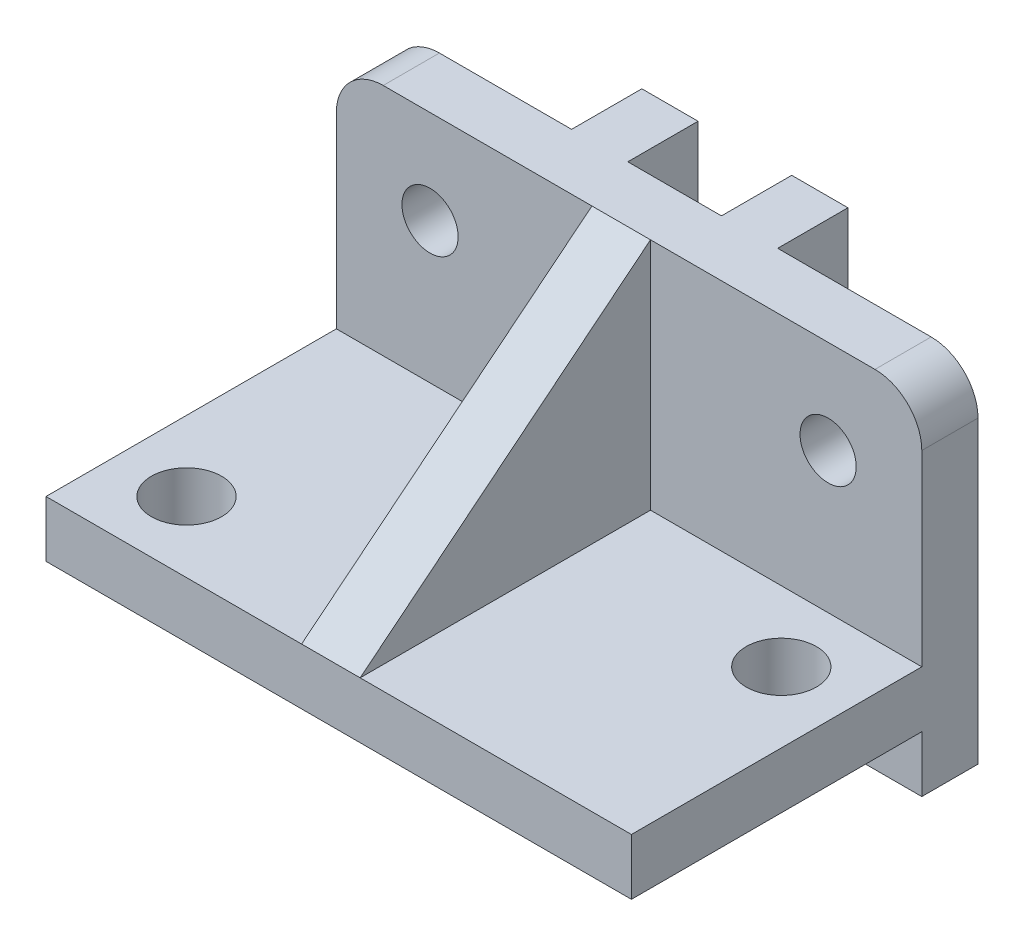
ISO-10303-21;
HEADER;
FILE_DESCRIPTION(('STEP AP214'),'2;1');
FILE_NAME('part.step','',(''),(''),'','','');
FILE_SCHEMA(('AUTOMOTIVE_DESIGN { 1 0 10303 214 1 1 1 1 }'));
ENDSEC;
DATA;
#1=APPLICATION_CONTEXT('core data for automotive mechanical design processes');
#2=APPLICATION_PROTOCOL_DEFINITION('international standard','automotive_design',2000,#1);
#3=PRODUCT_CONTEXT('',#1,'mechanical');
#4=PRODUCT('Part','Part','',(#3));
#5=PRODUCT_RELATED_PRODUCT_CATEGORY('part','',(#4));
#6=PRODUCT_DEFINITION_FORMATION('','',#4);
#7=PRODUCT_DEFINITION_CONTEXT('part definition',#1,'design');
#8=PRODUCT_DEFINITION('design','',#6,#7);
#9=PRODUCT_DEFINITION_SHAPE('','',#8);
#10=(LENGTH_UNIT() NAMED_UNIT(*) SI_UNIT(.MILLI.,.METRE.));
#11=(NAMED_UNIT(*) PLANE_ANGLE_UNIT() SI_UNIT($,.RADIAN.));
#12=(NAMED_UNIT(*) SI_UNIT($,.STERADIAN.) SOLID_ANGLE_UNIT());
#13=UNCERTAINTY_MEASURE_WITH_UNIT(LENGTH_MEASURE(1.E-05),#10,'distance_accuracy_value','');
#14=(GEOMETRIC_REPRESENTATION_CONTEXT(3) GLOBAL_UNCERTAINTY_ASSIGNED_CONTEXT((#13)) GLOBAL_UNIT_ASSIGNED_CONTEXT((#10,
#11,#12)) REPRESENTATION_CONTEXT('',''));
#15=CARTESIAN_POINT('',(0.,0.,0.));
#16=DIRECTION('',(0.,0.,1.));
#17=DIRECTION('',(1.,0.,0.));
#18=AXIS2_PLACEMENT_3D('',#15,#16,#17);
#19=CARTESIAN_POINT('',(0.,12.,0.));
#20=DIRECTION('',(0.,1.,0.));
#21=DIRECTION('',(0.,0.,1.));
#22=AXIS2_PLACEMENT_3D('',#19,#20,#21);
#23=PLANE('',#22);
#24=CARTESIAN_POINT('',(15.,12.,-15.));
#25=DIRECTION('',(0.,1.,0.));
#26=DIRECTION('',(0.,0.,1.));
#27=AXIS2_PLACEMENT_3D('',#24,#25,#26);
#28=CIRCLE('',#27,7.5);
#29=CARTESIAN_POINT('',(15.,12.,-7.5));
#30=VERTEX_POINT('',#29);
#31=EDGE_CURVE('E633',#30,#30,#28,.T.);
#32=ORIENTED_EDGE('',*,*,#31,.F.);
#33=EDGE_LOOP('',(#32));
#34=FACE_BOUND('',#33,.T.);
#35=DIRECTION('',(1.,0.,0.));
#36=VECTOR('',#35,1.);
#37=CARTESIAN_POINT('',(0.,12.,0.));
#38=LINE('',#37,#36);
#39=CARTESIAN_POINT('',(0.,12.,0.));
#40=VERTEX_POINT('',#39);
#41=CARTESIAN_POINT('',(54.5715836652944,12.,0.));
#42=VERTEX_POINT('',#41);
#43=EDGE_CURVE('E242',#40,#42,#38,.T.);
#44=ORIENTED_EDGE('',*,*,#43,.T.);
#45=DIRECTION('',(0.,0.,-1.));
#46=VECTOR('',#45,1.);
#47=CARTESIAN_POINT('',(54.5715836652944,12.,0.));
#48=LINE('',#47,#46);
#49=CARTESIAN_POINT('',(54.5715836652944,12.,-62.));
#50=VERTEX_POINT('',#49);
#51=EDGE_CURVE('E291',#42,#50,#48,.T.);
#52=ORIENTED_EDGE('',*,*,#51,.T.);
#53=DIRECTION('',(-1.,0.,0.));
#54=VECTOR('',#53,1.);
#55=CARTESIAN_POINT('',(125.,12.,-62.));
#56=LINE('',#55,#54);
#57=CARTESIAN_POINT('',(0.,12.,-62.));
#58=VERTEX_POINT('',#57);
#59=EDGE_CURVE('E247',#50,#58,#56,.T.);
#60=ORIENTED_EDGE('',*,*,#59,.T.);
#61=DIRECTION('',(0.,0.,1.));
#62=VECTOR('',#61,1.);
#63=CARTESIAN_POINT('',(0.,12.,-62.));
#64=LINE('',#63,#62);
#65=EDGE_CURVE('E237',#58,#40,#64,.T.);
#66=ORIENTED_EDGE('',*,*,#65,.T.);
#67=EDGE_LOOP('',(#44,#52,#60,#66));
#68=FACE_BOUND('',#67,.T.);
#69=ADVANCED_FACE('F41',(#34,#68),#23,.T.);
#70=CARTESIAN_POINT('',(110.,12.,-47.));
#71=DIRECTION('',(0.,1.,0.));
#72=DIRECTION('',(0.,0.,1.));
#73=AXIS2_PLACEMENT_3D('',#70,#71,#72);
#74=CIRCLE('',#73,7.5);
#75=CARTESIAN_POINT('',(110.,12.,-39.5));
#76=VERTEX_POINT('',#75);
#77=EDGE_CURVE('E636',#76,#76,#74,.T.);
#78=ORIENTED_EDGE('',*,*,#77,.F.);
#79=EDGE_LOOP('',(#78));
#80=FACE_BOUND('',#79,.T.);
#81=CARTESIAN_POINT('',(125.,12.,-62.));
#82=VERTEX_POINT('',#81);
#83=CARTESIAN_POINT('',(67.0750074098934,12.,-62.));
#84=VERTEX_POINT('',#83);
#85=EDGE_CURVE('E248',#82,#84,#56,.T.);
#86=ORIENTED_EDGE('',*,*,#85,.T.);
#87=DIRECTION('',(0.,0.,-1.));
#88=VECTOR('',#87,1.);
#89=CARTESIAN_POINT('',(67.0750074098934,12.,0.));
#90=LINE('',#89,#88);
#91=CARTESIAN_POINT('',(67.0750074098934,12.,0.));
#92=VERTEX_POINT('',#91);
#93=EDGE_CURVE('E210',#92,#84,#90,.T.);
#94=ORIENTED_EDGE('',*,*,#93,.F.);
#95=CARTESIAN_POINT('',(125.,12.,0.));
#96=VERTEX_POINT('',#95);
#97=EDGE_CURVE('E240',#92,#96,#38,.T.);
#98=ORIENTED_EDGE('',*,*,#97,.T.);
#99=DIRECTION('',(0.,0.,-1.));
#100=VECTOR('',#99,1.);
#101=CARTESIAN_POINT('',(125.,12.,0.));
#102=LINE('',#101,#100);
#103=EDGE_CURVE('E244',#96,#82,#102,.T.);
#104=ORIENTED_EDGE('',*,*,#103,.T.);
#105=EDGE_LOOP('',(#86,#94,#98,#104));
#106=FACE_BOUND('',#105,.T.);
#107=ADVANCED_FACE('F365',(#80,#106),#23,.T.);
#108=CARTESIAN_POINT('',(0.,62.,-62.));
#109=DIRECTION('',(0.,0.,1.));
#110=DIRECTION('',(1.,0.,0.));
#111=AXIS2_PLACEMENT_3D('',#108,#109,#110);
#112=PLANE('',#111);
#113=CARTESIAN_POINT('',(20.,42.,-62.));
#114=DIRECTION('',(0.,0.,1.));
#115=DIRECTION('',(1.,0.,0.));
#116=AXIS2_PLACEMENT_3D('',#113,#114,#115);
#117=CIRCLE('',#116,6.);
#118=CARTESIAN_POINT('',(26.,42.,-62.));
#119=VERTEX_POINT('',#118);
#120=EDGE_CURVE('E620',#119,#119,#117,.T.);
#121=ORIENTED_EDGE('',*,*,#120,.F.);
#122=EDGE_LOOP('',(#121));
#123=FACE_BOUND('',#122,.T.);
#124=DIRECTION('',(1.,0.,0.));
#125=VECTOR('',#124,1.);
#126=CARTESIAN_POINT('',(0.,62.,-62.));
#127=LINE('',#126,#125);
#128=CARTESIAN_POINT('',(10.,62.,-62.));
#129=VERTEX_POINT('',#128);
#130=CARTESIAN_POINT('',(54.5715836652944,62.,-62.));
#131=VERTEX_POINT('',#130);
#132=EDGE_CURVE('E204',#129,#131,#127,.T.);
#133=ORIENTED_EDGE('',*,*,#132,.F.);
#134=CARTESIAN_POINT('',(10.,52.,-62.));
#135=DIRECTION('',(0.,0.,1.));
#136=DIRECTION('',(1.,0.,0.));
#137=AXIS2_PLACEMENT_3D('',#134,#135,#136);
#138=CIRCLE('',#137,10.);
#139=CARTESIAN_POINT('',(0.,52.,-62.));
#140=VERTEX_POINT('',#139);
#141=EDGE_CURVE('E63',#129,#140,#138,.T.);
#142=ORIENTED_EDGE('',*,*,#141,.T.);
#143=DIRECTION('',(0.,-1.,0.));
#144=VECTOR('',#143,1.);
#145=CARTESIAN_POINT('',(0.,62.,-62.));
#146=LINE('',#145,#144);
#147=EDGE_CURVE('E236',#140,#58,#146,.T.);
#148=ORIENTED_EDGE('',*,*,#147,.T.);
#149=ORIENTED_EDGE('',*,*,#59,.F.);
#150=DIRECTION('',(0.,-1.,0.));
#151=VECTOR('',#150,1.);
#152=CARTESIAN_POINT('',(54.5715836652944,12.,-62.));
#153=LINE('',#152,#151);
#154=EDGE_CURVE('E214',#131,#50,#153,.T.);
#155=ORIENTED_EDGE('',*,*,#154,.F.);
#156=EDGE_LOOP('',(#133,#142,#148,#149,#155));
#157=FACE_BOUND('',#156,.T.);
#158=ADVANCED_FACE('F280',(#123,#157),#112,.T.);
#159=CARTESIAN_POINT('',(105.,42.,-62.));
#160=DIRECTION('',(0.,0.,1.));
#161=DIRECTION('',(1.,0.,0.));
#162=AXIS2_PLACEMENT_3D('',#159,#160,#161);
#163=CIRCLE('',#162,6.);
#164=CARTESIAN_POINT('',(111.,42.,-62.));
#165=VERTEX_POINT('',#164);
#166=EDGE_CURVE('E621',#165,#165,#163,.T.);
#167=ORIENTED_EDGE('',*,*,#166,.F.);
#168=EDGE_LOOP('',(#167));
#169=FACE_BOUND('',#168,.T.);
#170=DIRECTION('',(0.,-1.,0.));
#171=VECTOR('',#170,1.);
#172=CARTESIAN_POINT('',(125.,62.,-62.));
#173=LINE('',#172,#171);
#174=CARTESIAN_POINT('',(125.,52.,-62.));
#175=VERTEX_POINT('',#174);
#176=EDGE_CURVE('E226',#175,#82,#173,.T.);
#177=ORIENTED_EDGE('',*,*,#176,.F.);
#178=CARTESIAN_POINT('',(115.,52.,-62.));
#179=DIRECTION('',(0.,0.,1.));
#180=DIRECTION('',(1.,0.,0.));
#181=AXIS2_PLACEMENT_3D('',#178,#179,#180);
#182=CIRCLE('',#181,10.);
#183=CARTESIAN_POINT('',(115.,62.,-62.));
#184=VERTEX_POINT('',#183);
#185=EDGE_CURVE('E218',#175,#184,#182,.T.);
#186=ORIENTED_EDGE('',*,*,#185,.T.);
#187=CARTESIAN_POINT('',(67.0750074098934,62.,-62.));
#188=VERTEX_POINT('',#187);
#189=EDGE_CURVE('E201',#188,#184,#127,.T.);
#190=ORIENTED_EDGE('',*,*,#189,.F.);
#191=DIRECTION('',(0.,1.,0.));
#192=VECTOR('',#191,1.);
#193=CARTESIAN_POINT('',(67.0750074098934,62.,-62.));
#194=LINE('',#193,#192);
#195=EDGE_CURVE('E208',#84,#188,#194,.T.);
#196=ORIENTED_EDGE('',*,*,#195,.F.);
#197=ORIENTED_EDGE('',*,*,#85,.F.);
#198=EDGE_LOOP('',(#177,#186,#190,#196,#197));
#199=FACE_BOUND('',#198,.T.);
#200=ADVANCED_FACE('F217',(#169,#199),#112,.T.);
#201=CARTESIAN_POINT('',(0.,-12.,-74.));
#202=DIRECTION('',(0.,0.,-1.));
#203=DIRECTION('',(-1.,0.,0.));
#204=AXIS2_PLACEMENT_3D('',#201,#202,#203);
#205=PLANE('',#204);
#206=DIRECTION('',(1.,0.,0.));
#207=VECTOR('',#206,1.);
#208=CARTESIAN_POINT('',(0.,-12.,-74.));
#209=LINE('',#208,#207);
#210=CARTESIAN_POINT('',(50.2262150062898,-12.,-74.));
#211=VERTEX_POINT('',#210);
#212=CARTESIAN_POINT('',(70.2262150062898,-12.,-74.));
#213=VERTEX_POINT('',#212);
#214=EDGE_CURVE('E232',#211,#213,#209,.T.);
#215=ORIENTED_EDGE('',*,*,#214,.F.);
#216=DIRECTION('',(0.,-1.,0.));
#217=VECTOR('',#216,1.);
#218=CARTESIAN_POINT('',(50.2262150062898,62.,-74.));
#219=LINE('',#218,#217);
#220=CARTESIAN_POINT('',(50.2262150062898,62.,-74.));
#221=VERTEX_POINT('',#220);
#222=EDGE_CURVE('E305',#221,#211,#219,.T.);
#223=ORIENTED_EDGE('',*,*,#222,.F.);
#224=DIRECTION('',(1.,0.,0.));
#225=VECTOR('',#224,1.);
#226=CARTESIAN_POINT('',(0.,62.,-74.));
#227=LINE('',#226,#225);
#228=CARTESIAN_POINT('',(70.2262150062898,62.,-74.));
#229=VERTEX_POINT('',#228);
#230=EDGE_CURVE('E222',#221,#229,#227,.T.);
#231=ORIENTED_EDGE('',*,*,#230,.T.);
#232=DIRECTION('',(0.,1.,0.));
#233=VECTOR('',#232,1.);
#234=CARTESIAN_POINT('',(70.2262150062898,62.,-74.));
#235=LINE('',#234,#233);
#236=EDGE_CURVE('E321',#213,#229,#235,.T.);
#237=ORIENTED_EDGE('',*,*,#236,.F.);
#238=EDGE_LOOP('',(#215,#223,#231,#237));
#239=FACE_BOUND('',#238,.T.);
#240=ADVANCED_FACE('F409',(#239),#205,.T.);
#241=CARTESIAN_POINT('',(20.,42.,-74.));
#242=DIRECTION('',(0.,0.,1.));
#243=DIRECTION('',(1.,0.,0.));
#244=AXIS2_PLACEMENT_3D('',#241,#242,#243);
#245=CIRCLE('',#244,6.);
#246=CARTESIAN_POINT('',(26.,42.,-74.));
#247=VERTEX_POINT('',#246);
#248=EDGE_CURVE('E622',#247,#247,#245,.T.);
#249=ORIENTED_EDGE('',*,*,#248,.T.);
#250=EDGE_LOOP('',(#249));
#251=FACE_BOUND('',#250,.T.);
#252=DIRECTION('',(0.,1.,0.));
#253=VECTOR('',#252,1.);
#254=CARTESIAN_POINT('',(0.,-12.,-74.));
#255=LINE('',#254,#253);
#256=CARTESIAN_POINT('',(0.,-12.,-74.));
#257=VERTEX_POINT('',#256);
#258=CARTESIAN_POINT('',(0.,52.,-74.));
#259=VERTEX_POINT('',#258);
#260=EDGE_CURVE('E350',#257,#259,#255,.T.);
#261=ORIENTED_EDGE('',*,*,#260,.T.);
#262=CARTESIAN_POINT('',(10.,52.,-74.));
#263=DIRECTION('',(0.,0.,-1.));
#264=DIRECTION('',(-1.,0.,0.));
#265=AXIS2_PLACEMENT_3D('',#262,#263,#264);
#266=CIRCLE('',#265,10.);
#267=CARTESIAN_POINT('',(10.,62.,-74.));
#268=VERTEX_POINT('',#267);
#269=EDGE_CURVE('E11',#259,#268,#266,.T.);
#270=ORIENTED_EDGE('',*,*,#269,.T.);
#271=CARTESIAN_POINT('',(38.2262150062898,62.,-74.));
#272=VERTEX_POINT('',#271);
#273=EDGE_CURVE('E219',#268,#272,#227,.T.);
#274=ORIENTED_EDGE('',*,*,#273,.T.);
#275=DIRECTION('',(0.,1.,0.));
#276=VECTOR('',#275,1.);
#277=CARTESIAN_POINT('',(38.2262150062898,-12.,-74.));
#278=LINE('',#277,#276);
#279=CARTESIAN_POINT('',(38.2262150062898,-12.,-74.));
#280=VERTEX_POINT('',#279);
#281=EDGE_CURVE('E302',#280,#272,#278,.T.);
#282=ORIENTED_EDGE('',*,*,#281,.F.);
#283=EDGE_CURVE('E229',#257,#280,#209,.T.);
#284=ORIENTED_EDGE('',*,*,#283,.F.);
#285=EDGE_LOOP('',(#261,#270,#274,#282,#284));
#286=FACE_BOUND('',#285,.T.);
#287=ADVANCED_FACE('F424',(#251,#286),#205,.T.);
#288=CARTESIAN_POINT('',(0.,0.,0.));
#289=DIRECTION('',(0.,1.,0.));
#290=DIRECTION('',(0.,0.,1.));
#291=AXIS2_PLACEMENT_3D('',#288,#289,#290);
#292=PLANE('',#291);
#293=CARTESIAN_POINT('',(15.,0.,-15.));
#294=DIRECTION('',(0.,1.,0.));
#295=DIRECTION('',(0.,0.,1.));
#296=AXIS2_PLACEMENT_3D('',#293,#294,#295);
#297=CIRCLE('',#296,7.5);
#298=CARTESIAN_POINT('',(15.,0.,-7.5));
#299=VERTEX_POINT('',#298);
#300=EDGE_CURVE('E194',#299,#299,#297,.T.);
#301=ORIENTED_EDGE('',*,*,#300,.T.);
#302=EDGE_LOOP('',(#301));
#303=FACE_BOUND('',#302,.T.);
#304=CARTESIAN_POINT('',(110.,0.,-47.));
#305=DIRECTION('',(0.,1.,0.));
#306=DIRECTION('',(0.,0.,1.));
#307=AXIS2_PLACEMENT_3D('',#304,#305,#306);
#308=CIRCLE('',#307,7.5);
#309=CARTESIAN_POINT('',(110.,0.,-39.5));
#310=VERTEX_POINT('',#309);
#311=EDGE_CURVE('E639',#310,#310,#308,.T.);
#312=ORIENTED_EDGE('',*,*,#311,.T.);
#313=EDGE_LOOP('',(#312));
#314=FACE_BOUND('',#313,.T.);
#315=DIRECTION('',(0.,0.,1.));
#316=VECTOR('',#315,1.);
#317=CARTESIAN_POINT('',(0.,0.,-62.));
#318=LINE('',#317,#316);
#319=CARTESIAN_POINT('',(0.,0.,-62.));
#320=VERTEX_POINT('',#319);
#321=CARTESIAN_POINT('',(0.,0.,0.));
#322=VERTEX_POINT('',#321);
#323=EDGE_CURVE('E221',#320,#322,#318,.T.);
#324=ORIENTED_EDGE('',*,*,#323,.F.);
#325=DIRECTION('',(-1.,0.,0.));
#326=VECTOR('',#325,1.);
#327=CARTESIAN_POINT('',(125.,0.,-62.));
#328=LINE('',#327,#326);
#329=CARTESIAN_POINT('',(125.,0.,-62.));
#330=VERTEX_POINT('',#329);
#331=EDGE_CURVE('E241',#330,#320,#328,.T.);
#332=ORIENTED_EDGE('',*,*,#331,.F.);
#333=DIRECTION('',(0.,0.,-1.));
#334=VECTOR('',#333,1.);
#335=CARTESIAN_POINT('',(125.,0.,0.));
#336=LINE('',#335,#334);
#337=CARTESIAN_POINT('',(125.,0.,0.));
#338=VERTEX_POINT('',#337);
#339=EDGE_CURVE('E255',#338,#330,#336,.T.);
#340=ORIENTED_EDGE('',*,*,#339,.F.);
#341=DIRECTION('',(1.,0.,0.));
#342=VECTOR('',#341,1.);
#343=CARTESIAN_POINT('',(0.,0.,0.));
#344=LINE('',#343,#342);
#345=EDGE_CURVE('E253',#322,#338,#344,.T.);
#346=ORIENTED_EDGE('',*,*,#345,.F.);
#347=EDGE_LOOP('',(#324,#332,#340,#346));
#348=FACE_BOUND('',#347,.T.);
#349=ADVANCED_FACE('F373',(#303,#314,#348),#292,.F.);
#350=CARTESIAN_POINT('',(0.,12.,-62.));
#351=DIRECTION('',(1.,0.,0.));
#352=DIRECTION('',(0.,0.,-1.));
#353=AXIS2_PLACEMENT_3D('',#350,#351,#352);
#354=PLANE('',#353);
#355=ORIENTED_EDGE('',*,*,#147,.F.);
#356=DIRECTION('',(0.,0.,1.));
#357=VECTOR('',#356,1.);
#358=CARTESIAN_POINT('',(0.,52.,-74.));
#359=LINE('',#358,#357);
#360=EDGE_CURVE('E49',#140,#259,#359,.F.);
#361=ORIENTED_EDGE('',*,*,#360,.T.);
#362=ORIENTED_EDGE('',*,*,#260,.F.);
#363=DIRECTION('',(0.,0.,-1.));
#364=VECTOR('',#363,1.);
#365=CARTESIAN_POINT('',(0.,-12.,-62.));
#366=LINE('',#365,#364);
#367=CARTESIAN_POINT('',(0.,-12.,-62.));
#368=VERTEX_POINT('',#367);
#369=EDGE_CURVE('E347',#368,#257,#366,.T.);
#370=ORIENTED_EDGE('',*,*,#369,.F.);
#371=DIRECTION('',(0.,-1.,0.));
#372=VECTOR('',#371,1.);
#373=CARTESIAN_POINT('',(0.,0.,-62.));
#374=LINE('',#373,#372);
#375=EDGE_CURVE('E344',#320,#368,#374,.T.);
#376=ORIENTED_EDGE('',*,*,#375,.F.);
#377=ORIENTED_EDGE('',*,*,#323,.T.);
#378=DIRECTION('',(0.,-1.,0.));
#379=VECTOR('',#378,1.);
#380=CARTESIAN_POINT('',(0.,12.,0.));
#381=LINE('',#380,#379);
#382=EDGE_CURVE('E262',#40,#322,#381,.T.);
#383=ORIENTED_EDGE('',*,*,#382,.F.);
#384=ORIENTED_EDGE('',*,*,#65,.F.);
#385=EDGE_LOOP('',(#355,#361,#362,#370,#376,#377,#383,#384));
#386=FACE_BOUND('',#385,.T.);
#387=ADVANCED_FACE('F378',(#386),#354,.F.);
#388=CARTESIAN_POINT('',(0.,12.,0.));
#389=DIRECTION('',(0.,0.,-1.));
#390=DIRECTION('',(-1.,0.,0.));
#391=AXIS2_PLACEMENT_3D('',#388,#389,#390);
#392=PLANE('',#391);
#393=ORIENTED_EDGE('',*,*,#97,.F.);
#394=DIRECTION('',(1.,0.,0.));
#395=VECTOR('',#394,1.);
#396=CARTESIAN_POINT('',(5.07500740989336,12.,0.));
#397=LINE('',#396,#395);
#398=EDGE_CURVE('E190',#42,#92,#397,.T.);
#399=ORIENTED_EDGE('',*,*,#398,.F.);
#400=ORIENTED_EDGE('',*,*,#43,.F.);
#401=ORIENTED_EDGE('',*,*,#382,.T.);
#402=ORIENTED_EDGE('',*,*,#345,.T.);
#403=DIRECTION('',(0.,-1.,0.));
#404=VECTOR('',#403,1.);
#405=CARTESIAN_POINT('',(125.,12.,0.));
#406=LINE('',#405,#404);
#407=EDGE_CURVE('E250',#96,#338,#406,.T.);
#408=ORIENTED_EDGE('',*,*,#407,.F.);
#409=EDGE_LOOP('',(#393,#399,#400,#401,#402,#408));
#410=FACE_BOUND('',#409,.T.);
#411=ADVANCED_FACE('F369',(#410),#392,.F.);
#412=CARTESIAN_POINT('',(125.,12.,0.));
#413=DIRECTION('',(-1.,0.,0.));
#414=DIRECTION('',(0.,0.,1.));
#415=AXIS2_PLACEMENT_3D('',#412,#413,#414);
#416=PLANE('',#415);
#417=DIRECTION('',(0.,1.,0.));
#418=VECTOR('',#417,1.);
#419=CARTESIAN_POINT('',(125.,-12.,-74.));
#420=LINE('',#419,#418);
#421=CARTESIAN_POINT('',(125.,-12.,-74.));
#422=VERTEX_POINT('',#421);
#423=CARTESIAN_POINT('',(125.,52.,-74.));
#424=VERTEX_POINT('',#423);
#425=EDGE_CURVE('E357',#422,#424,#420,.T.);
#426=ORIENTED_EDGE('',*,*,#425,.T.);
#427=DIRECTION('',(0.,0.,1.));
#428=VECTOR('',#427,1.);
#429=CARTESIAN_POINT('',(125.,52.,-62.));
#430=LINE('',#429,#428);
#431=EDGE_CURVE('E265',#424,#175,#430,.T.);
#432=ORIENTED_EDGE('',*,*,#431,.T.);
#433=ORIENTED_EDGE('',*,*,#176,.T.);
#434=ORIENTED_EDGE('',*,*,#103,.F.);
#435=ORIENTED_EDGE('',*,*,#407,.T.);
#436=ORIENTED_EDGE('',*,*,#339,.T.);
#437=DIRECTION('',(0.,-1.,0.));
#438=VECTOR('',#437,1.);
#439=CARTESIAN_POINT('',(125.,0.,-62.));
#440=LINE('',#439,#438);
#441=CARTESIAN_POINT('',(125.,-12.,-62.));
#442=VERTEX_POINT('',#441);
#443=EDGE_CURVE('E343',#330,#442,#440,.T.);
#444=ORIENTED_EDGE('',*,*,#443,.T.);
#445=DIRECTION('',(0.,0.,-1.));
#446=VECTOR('',#445,1.);
#447=CARTESIAN_POINT('',(125.,-12.,-62.));
#448=LINE('',#447,#446);
#449=EDGE_CURVE('E355',#442,#422,#448,.T.);
#450=ORIENTED_EDGE('',*,*,#449,.T.);
#451=EDGE_LOOP('',(#426,#432,#433,#434,#435,#436,#444,#450));
#452=FACE_BOUND('',#451,.T.);
#453=ADVANCED_FACE('F363',(#452),#416,.F.);
#454=CARTESIAN_POINT('',(0.,62.,-74.));
#455=DIRECTION('',(0.,1.,0.));
#456=DIRECTION('',(0.,0.,1.));
#457=AXIS2_PLACEMENT_3D('',#454,#455,#456);
#458=PLANE('',#457);
#459=ORIENTED_EDGE('',*,*,#273,.F.);
#460=DIRECTION('',(0.,0.,1.));
#461=VECTOR('',#460,1.);
#462=CARTESIAN_POINT('',(10.,62.,-62.));
#463=LINE('',#462,#461);
#464=EDGE_CURVE('E273',#268,#129,#463,.T.);
#465=ORIENTED_EDGE('',*,*,#464,.T.);
#466=ORIENTED_EDGE('',*,*,#132,.T.);
#467=DIRECTION('',(1.,0.,0.));
#468=VECTOR('',#467,1.);
#469=CARTESIAN_POINT('',(5.07500740989336,62.,-62.));
#470=LINE('',#469,#468);
#471=EDGE_CURVE('E187',#131,#188,#470,.T.);
#472=ORIENTED_EDGE('',*,*,#471,.T.);
#473=ORIENTED_EDGE('',*,*,#189,.T.);
#474=DIRECTION('',(0.,0.,1.));
#475=VECTOR('',#474,1.);
#476=CARTESIAN_POINT('',(115.,62.,-74.));
#477=LINE('',#476,#475);
#478=CARTESIAN_POINT('',(115.,62.,-74.));
#479=VERTEX_POINT('',#478);
#480=EDGE_CURVE('E269',#184,#479,#477,.F.);
#481=ORIENTED_EDGE('',*,*,#480,.T.);
#482=CARTESIAN_POINT('',(82.2262150062898,62.,-74.));
#483=VERTEX_POINT('',#482);
#484=EDGE_CURVE('E224',#483,#479,#227,.T.);
#485=ORIENTED_EDGE('',*,*,#484,.F.);
#486=DIRECTION('',(0.,0.,1.));
#487=VECTOR('',#486,1.);
#488=CARTESIAN_POINT('',(82.2262150062898,62.,-89.));
#489=LINE('',#488,#487);
#490=CARTESIAN_POINT('',(82.2262150062898,62.,-89.));
#491=VERTEX_POINT('',#490);
#492=EDGE_CURVE('E340',#491,#483,#489,.T.);
#493=ORIENTED_EDGE('',*,*,#492,.F.);
#494=DIRECTION('',(1.,0.,0.));
#495=VECTOR('',#494,1.);
#496=CARTESIAN_POINT('',(82.2262150062898,62.,-89.));
#497=LINE('',#496,#495);
#498=CARTESIAN_POINT('',(70.2262150062898,62.,-89.));
#499=VERTEX_POINT('',#498);
#500=EDGE_CURVE('E317',#499,#491,#497,.T.);
#501=ORIENTED_EDGE('',*,*,#500,.F.);
#502=DIRECTION('',(0.,0.,1.));
#503=VECTOR('',#502,1.);
#504=CARTESIAN_POINT('',(70.2262150062898,62.,-89.));
#505=LINE('',#504,#503);
#506=EDGE_CURVE('E327',#499,#229,#505,.T.);
#507=ORIENTED_EDGE('',*,*,#506,.T.);
#508=ORIENTED_EDGE('',*,*,#230,.F.);
#509=DIRECTION('',(0.,0.,1.));
#510=VECTOR('',#509,1.);
#511=CARTESIAN_POINT('',(50.2262150062898,62.,-89.));
#512=LINE('',#511,#510);
#513=CARTESIAN_POINT('',(50.2262150062898,62.,-89.));
#514=VERTEX_POINT('',#513);
#515=EDGE_CURVE('E293',#514,#221,#512,.T.);
#516=ORIENTED_EDGE('',*,*,#515,.F.);
#517=DIRECTION('',(1.,0.,0.));
#518=VECTOR('',#517,1.);
#519=CARTESIAN_POINT('',(38.2262150062898,62.,-89.));
#520=LINE('',#519,#518);
#521=CARTESIAN_POINT('',(38.2262150062898,62.,-89.));
#522=VERTEX_POINT('',#521);
#523=EDGE_CURVE('E306',#522,#514,#520,.T.);
#524=ORIENTED_EDGE('',*,*,#523,.F.);
#525=DIRECTION('',(0.,0.,1.));
#526=VECTOR('',#525,1.);
#527=CARTESIAN_POINT('',(38.2262150062898,62.,-89.));
#528=LINE('',#527,#526);
#529=EDGE_CURVE('E299',#522,#272,#528,.T.);
#530=ORIENTED_EDGE('',*,*,#529,.T.);
#531=EDGE_LOOP('',(#459,#465,#466,#472,#473,#481,#485,#493,#501,#507,#508,#516,#524,#530));
#532=FACE_BOUND('',#531,.T.);
#533=ADVANCED_FACE('F199',(#532),#458,.T.);
#534=CARTESIAN_POINT('',(105.,42.,-74.));
#535=DIRECTION('',(0.,0.,1.));
#536=DIRECTION('',(1.,0.,0.));
#537=AXIS2_PLACEMENT_3D('',#534,#535,#536);
#538=CIRCLE('',#537,6.);
#539=CARTESIAN_POINT('',(111.,42.,-74.));
#540=VERTEX_POINT('',#539);
#541=EDGE_CURVE('E625',#540,#540,#538,.T.);
#542=ORIENTED_EDGE('',*,*,#541,.T.);
#543=EDGE_LOOP('',(#542));
#544=FACE_BOUND('',#543,.T.);
#545=ORIENTED_EDGE('',*,*,#484,.T.);
#546=CARTESIAN_POINT('',(115.,52.,-74.));
#547=DIRECTION('',(0.,0.,-1.));
#548=DIRECTION('',(-1.,0.,0.));
#549=AXIS2_PLACEMENT_3D('',#546,#547,#548);
#550=CIRCLE('',#549,10.);
#551=EDGE_CURVE('E271',#479,#424,#550,.T.);
#552=ORIENTED_EDGE('',*,*,#551,.T.);
#553=ORIENTED_EDGE('',*,*,#425,.F.);
#554=CARTESIAN_POINT('',(82.2262150062898,-12.,-74.));
#555=VERTEX_POINT('',#554);
#556=EDGE_CURVE('E233',#555,#422,#209,.T.);
#557=ORIENTED_EDGE('',*,*,#556,.F.);
#558=DIRECTION('',(0.,-1.,0.));
#559=VECTOR('',#558,1.);
#560=CARTESIAN_POINT('',(82.2262150062898,-12.,-74.));
#561=LINE('',#560,#559);
#562=EDGE_CURVE('E309',#483,#555,#561,.T.);
#563=ORIENTED_EDGE('',*,*,#562,.F.);
#564=EDGE_LOOP('',(#545,#552,#553,#557,#563));
#565=FACE_BOUND('',#564,.T.);
#566=ADVANCED_FACE('F388',(#544,#565),#205,.T.);
#567=CARTESIAN_POINT('',(0.,-12.,-62.));
#568=DIRECTION('',(0.,-1.,0.));
#569=DIRECTION('',(0.,0.,-1.));
#570=AXIS2_PLACEMENT_3D('',#567,#568,#569);
#571=PLANE('',#570);
#572=ORIENTED_EDGE('',*,*,#449,.F.);
#573=DIRECTION('',(1.,0.,0.));
#574=VECTOR('',#573,1.);
#575=CARTESIAN_POINT('',(0.,-12.,-62.));
#576=LINE('',#575,#574);
#577=EDGE_CURVE('E234',#368,#442,#576,.T.);
#578=ORIENTED_EDGE('',*,*,#577,.F.);
#579=ORIENTED_EDGE('',*,*,#369,.T.);
#580=ORIENTED_EDGE('',*,*,#283,.T.);
#581=DIRECTION('',(0.,0.,1.));
#582=VECTOR('',#581,1.);
#583=CARTESIAN_POINT('',(38.2262150062898,-12.,-89.));
#584=LINE('',#583,#582);
#585=CARTESIAN_POINT('',(38.2262150062898,-12.,-89.));
#586=VERTEX_POINT('',#585);
#587=EDGE_CURVE('E297',#586,#280,#584,.T.);
#588=ORIENTED_EDGE('',*,*,#587,.F.);
#589=DIRECTION('',(-1.,0.,0.));
#590=VECTOR('',#589,1.);
#591=CARTESIAN_POINT('',(50.2262150062898,-12.,-89.));
#592=LINE('',#591,#590);
#593=CARTESIAN_POINT('',(50.2262150062898,-12.,-89.));
#594=VERTEX_POINT('',#593);
#595=EDGE_CURVE('E311',#594,#586,#592,.T.);
#596=ORIENTED_EDGE('',*,*,#595,.F.);
#597=DIRECTION('',(0.,0.,1.));
#598=VECTOR('',#597,1.);
#599=CARTESIAN_POINT('',(50.2262150062898,-12.,-89.));
#600=LINE('',#599,#598);
#601=EDGE_CURVE('E295',#594,#211,#600,.T.);
#602=ORIENTED_EDGE('',*,*,#601,.T.);
#603=ORIENTED_EDGE('',*,*,#214,.T.);
#604=DIRECTION('',(0.,0.,1.));
#605=VECTOR('',#604,1.);
#606=CARTESIAN_POINT('',(70.2262150062898,-12.,-89.));
#607=LINE('',#606,#605);
#608=CARTESIAN_POINT('',(70.2262150062898,-12.,-89.));
#609=VERTEX_POINT('',#608);
#610=EDGE_CURVE('E334',#609,#213,#607,.T.);
#611=ORIENTED_EDGE('',*,*,#610,.F.);
#612=DIRECTION('',(-1.,0.,0.));
#613=VECTOR('',#612,1.);
#614=CARTESIAN_POINT('',(70.2262150062898,-12.,-89.));
#615=LINE('',#614,#613);
#616=CARTESIAN_POINT('',(82.2262150062898,-12.,-89.));
#617=VERTEX_POINT('',#616);
#618=EDGE_CURVE('E323',#617,#609,#615,.T.);
#619=ORIENTED_EDGE('',*,*,#618,.F.);
#620=DIRECTION('',(0.,0.,1.));
#621=VECTOR('',#620,1.);
#622=CARTESIAN_POINT('',(82.2262150062898,-12.,-89.));
#623=LINE('',#622,#621);
#624=EDGE_CURVE('E337',#617,#555,#623,.T.);
#625=ORIENTED_EDGE('',*,*,#624,.T.);
#626=ORIENTED_EDGE('',*,*,#556,.T.);
#627=EDGE_LOOP('',(#572,#578,#579,#580,#588,#596,#602,#603,#611,#619,#625,#626));
#628=FACE_BOUND('',#627,.T.);
#629=ADVANCED_FACE('F382',(#628),#571,.T.);
#630=CARTESIAN_POINT('',(0.,0.,-62.));
#631=DIRECTION('',(0.,0.,1.));
#632=DIRECTION('',(1.,0.,0.));
#633=AXIS2_PLACEMENT_3D('',#630,#631,#632);
#634=PLANE('',#633);
#635=ORIENTED_EDGE('',*,*,#443,.F.);
#636=ORIENTED_EDGE('',*,*,#331,.T.);
#637=ORIENTED_EDGE('',*,*,#375,.T.);
#638=ORIENTED_EDGE('',*,*,#577,.T.);
#639=EDGE_LOOP('',(#635,#636,#637,#638));
#640=FACE_BOUND('',#639,.T.);
#641=ADVANCED_FACE('F376',(#640),#634,.T.);
#642=CARTESIAN_POINT('',(82.2262150062898,-12.,-89.));
#643=DIRECTION('',(-1.,0.,0.));
#644=DIRECTION('',(0.,0.,1.));
#645=AXIS2_PLACEMENT_3D('',#642,#643,#644);
#646=PLANE('',#645);
#647=ORIENTED_EDGE('',*,*,#562,.T.);
#648=ORIENTED_EDGE('',*,*,#624,.F.);
#649=DIRECTION('',(0.,-1.,0.));
#650=VECTOR('',#649,1.);
#651=CARTESIAN_POINT('',(82.2262150062898,-12.,-89.));
#652=LINE('',#651,#650);
#653=EDGE_CURVE('E320',#491,#617,#652,.T.);
#654=ORIENTED_EDGE('',*,*,#653,.F.);
#655=ORIENTED_EDGE('',*,*,#492,.T.);
#656=EDGE_LOOP('',(#647,#648,#654,#655));
#657=FACE_BOUND('',#656,.T.);
#658=ADVANCED_FACE('F396',(#657),#646,.F.);
#659=CARTESIAN_POINT('',(70.2262150062898,62.,-89.));
#660=DIRECTION('',(1.,0.,0.));
#661=DIRECTION('',(0.,1.,0.));
#662=AXIS2_PLACEMENT_3D('',#659,#660,#661);
#663=PLANE('',#662);
#664=ORIENTED_EDGE('',*,*,#236,.T.);
#665=ORIENTED_EDGE('',*,*,#506,.F.);
#666=DIRECTION('',(0.,1.,0.));
#667=VECTOR('',#666,1.);
#668=CARTESIAN_POINT('',(70.2262150062898,62.,-89.));
#669=LINE('',#668,#667);
#670=EDGE_CURVE('E325',#609,#499,#669,.T.);
#671=ORIENTED_EDGE('',*,*,#670,.F.);
#672=ORIENTED_EDGE('',*,*,#610,.T.);
#673=EDGE_LOOP('',(#664,#665,#671,#672));
#674=FACE_BOUND('',#673,.T.);
#675=ADVANCED_FACE('F404',(#674),#663,.F.);
#676=CARTESIAN_POINT('',(0.,0.,-89.));
#677=DIRECTION('',(0.,0.,1.));
#678=DIRECTION('',(1.,0.,0.));
#679=AXIS2_PLACEMENT_3D('',#676,#677,#678);
#680=PLANE('',#679);
#681=ORIENTED_EDGE('',*,*,#500,.T.);
#682=ORIENTED_EDGE('',*,*,#653,.T.);
#683=ORIENTED_EDGE('',*,*,#618,.T.);
#684=ORIENTED_EDGE('',*,*,#670,.T.);
#685=EDGE_LOOP('',(#681,#682,#683,#684));
#686=FACE_BOUND('',#685,.T.);
#687=ADVANCED_FACE('F398',(#686),#680,.F.);
#688=CARTESIAN_POINT('',(50.2262150062898,62.,-89.));
#689=DIRECTION('',(-1.,0.,0.));
#690=DIRECTION('',(0.,-1.,0.));
#691=AXIS2_PLACEMENT_3D('',#688,#689,#690);
#692=PLANE('',#691);
#693=ORIENTED_EDGE('',*,*,#222,.T.);
#694=ORIENTED_EDGE('',*,*,#601,.F.);
#695=DIRECTION('',(0.,-1.,0.));
#696=VECTOR('',#695,1.);
#697=CARTESIAN_POINT('',(50.2262150062898,62.,-89.));
#698=LINE('',#697,#696);
#699=EDGE_CURVE('E313',#514,#594,#698,.T.);
#700=ORIENTED_EDGE('',*,*,#699,.F.);
#701=ORIENTED_EDGE('',*,*,#515,.T.);
#702=EDGE_LOOP('',(#693,#694,#700,#701));
#703=FACE_BOUND('',#702,.T.);
#704=ADVANCED_FACE('F413',(#703),#692,.F.);
#705=CARTESIAN_POINT('',(38.2262150062898,-12.,-89.));
#706=DIRECTION('',(1.,0.,0.));
#707=DIRECTION('',(0.,0.,-1.));
#708=AXIS2_PLACEMENT_3D('',#705,#706,#707);
#709=PLANE('',#708);
#710=ORIENTED_EDGE('',*,*,#281,.T.);
#711=ORIENTED_EDGE('',*,*,#529,.F.);
#712=DIRECTION('',(0.,1.,0.));
#713=VECTOR('',#712,1.);
#714=CARTESIAN_POINT('',(38.2262150062898,-12.,-89.));
#715=LINE('',#714,#713);
#716=EDGE_CURVE('E301',#586,#522,#715,.T.);
#717=ORIENTED_EDGE('',*,*,#716,.F.);
#718=ORIENTED_EDGE('',*,*,#587,.T.);
#719=EDGE_LOOP('',(#710,#711,#717,#718));
#720=FACE_BOUND('',#719,.T.);
#721=ADVANCED_FACE('F421',(#720),#709,.F.);
#722=CARTESIAN_POINT('',(0.,0.,-89.));
#723=DIRECTION('',(0.,0.,-1.));
#724=DIRECTION('',(-1.,0.,0.));
#725=AXIS2_PLACEMENT_3D('',#722,#723,#724);
#726=PLANE('',#725);
#727=ORIENTED_EDGE('',*,*,#523,.T.);
#728=ORIENTED_EDGE('',*,*,#699,.T.);
#729=ORIENTED_EDGE('',*,*,#595,.T.);
#730=ORIENTED_EDGE('',*,*,#716,.T.);
#731=EDGE_LOOP('',(#727,#728,#729,#730));
#732=FACE_BOUND('',#731,.T.);
#733=ADVANCED_FACE('F418',(#732),#726,.T.);
#734=CARTESIAN_POINT('',(54.5715836652944,12.,0.));
#735=DIRECTION('',(1.,0.,0.));
#736=DIRECTION('',(0.,0.,-1.));
#737=AXIS2_PLACEMENT_3D('',#734,#735,#736);
#738=PLANE('',#737);
#739=ORIENTED_EDGE('',*,*,#51,.F.);
#740=DIRECTION('',(0.,0.627752451189782,-0.778413039475329));
#741=VECTOR('',#740,1.);
#742=CARTESIAN_POINT('',(54.5715836652944,12.,0.));
#743=LINE('',#742,#741);
#744=EDGE_CURVE('E205',#42,#131,#743,.T.);
#745=ORIENTED_EDGE('',*,*,#744,.T.);
#746=ORIENTED_EDGE('',*,*,#154,.T.);
#747=EDGE_LOOP('',(#739,#745,#746));
#748=FACE_BOUND('',#747,.T.);
#749=ADVANCED_FACE('F532',(#748),#738,.F.);
#750=CARTESIAN_POINT('',(67.0750074098934,62.,0.));
#751=DIRECTION('',(-1.,0.,0.));
#752=DIRECTION('',(0.,0.,1.));
#753=AXIS2_PLACEMENT_3D('',#750,#751,#752);
#754=PLANE('',#753);
#755=ORIENTED_EDGE('',*,*,#195,.T.);
#756=DIRECTION('',(0.,0.627752451189782,-0.778413039475329));
#757=VECTOR('',#756,1.);
#758=CARTESIAN_POINT('',(67.0750074098934,12.,0.));
#759=LINE('',#758,#757);
#760=EDGE_CURVE('E183',#92,#188,#759,.T.);
#761=ORIENTED_EDGE('',*,*,#760,.F.);
#762=ORIENTED_EDGE('',*,*,#93,.T.);
#763=EDGE_LOOP('',(#755,#761,#762));
#764=FACE_BOUND('',#763,.T.);
#765=ADVANCED_FACE('F209',(#764),#754,.F.);
#766=CARTESIAN_POINT('',(5.07500740989336,12.,0.));
#767=DIRECTION('',(0.,-0.778413039475329,-0.627752451189782));
#768=DIRECTION('',(0.,0.627752451189782,-0.778413039475329));
#769=AXIS2_PLACEMENT_3D('',#766,#767,#768);
#770=PLANE('',#769);
#771=ORIENTED_EDGE('',*,*,#398,.T.);
#772=ORIENTED_EDGE('',*,*,#760,.T.);
#773=ORIENTED_EDGE('',*,*,#471,.F.);
#774=ORIENTED_EDGE('',*,*,#744,.F.);
#775=EDGE_LOOP('',(#771,#772,#773,#774));
#776=FACE_BOUND('',#775,.T.);
#777=ADVANCED_FACE('F185',(#776),#770,.F.);
#778=CARTESIAN_POINT('',(115.,52.,0.));
#779=DIRECTION('',(0.,0.,-1.));
#780=DIRECTION('',(-1.,0.,0.));
#781=AXIS2_PLACEMENT_3D('',#778,#779,#780);
#782=CYLINDRICAL_SURFACE('',#781,10.);
#783=ORIENTED_EDGE('',*,*,#551,.F.);
#784=ORIENTED_EDGE('',*,*,#480,.F.);
#785=ORIENTED_EDGE('',*,*,#185,.F.);
#786=ORIENTED_EDGE('',*,*,#431,.F.);
#787=EDGE_LOOP('',(#783,#784,#785,#786));
#788=FACE_BOUND('',#787,.T.);
#789=ADVANCED_FACE('F392',(#788),#782,.T.);
#790=CARTESIAN_POINT('',(10.,52.,-74.));
#791=DIRECTION('',(0.,0.,-1.));
#792=DIRECTION('',(-1.,0.,0.));
#793=AXIS2_PLACEMENT_3D('',#790,#791,#792);
#794=CYLINDRICAL_SURFACE('',#793,10.);
#795=ORIENTED_EDGE('',*,*,#269,.F.);
#796=ORIENTED_EDGE('',*,*,#360,.F.);
#797=ORIENTED_EDGE('',*,*,#141,.F.);
#798=ORIENTED_EDGE('',*,*,#464,.F.);
#799=EDGE_LOOP('',(#795,#796,#797,#798));
#800=FACE_BOUND('',#799,.T.);
#801=ADVANCED_FACE('F43',(#800),#794,.T.);
#802=CARTESIAN_POINT('',(110.,0.,-47.));
#803=DIRECTION('',(0.,1.,0.));
#804=DIRECTION('',(0.,0.,1.));
#805=AXIS2_PLACEMENT_3D('',#802,#803,#804);
#806=CYLINDRICAL_SURFACE('',#805,7.5);
#807=ORIENTED_EDGE('',*,*,#311,.F.);
#808=EDGE_LOOP('',(#807));
#809=FACE_BOUND('',#808,.T.);
#810=ORIENTED_EDGE('',*,*,#77,.T.);
#811=EDGE_LOOP('',(#810));
#812=FACE_BOUND('',#811,.T.);
#813=ADVANCED_FACE('F426',(#809,#812),#806,.F.);
#814=CARTESIAN_POINT('',(15.,0.,-15.));
#815=DIRECTION('',(0.,1.,0.));
#816=DIRECTION('',(0.,0.,1.));
#817=AXIS2_PLACEMENT_3D('',#814,#815,#816);
#818=CYLINDRICAL_SURFACE('',#817,7.5);
#819=ORIENTED_EDGE('',*,*,#300,.F.);
#820=EDGE_LOOP('',(#819));
#821=FACE_BOUND('',#820,.T.);
#822=ORIENTED_EDGE('',*,*,#31,.T.);
#823=EDGE_LOOP('',(#822));
#824=FACE_BOUND('',#823,.T.);
#825=ADVANCED_FACE('F431',(#821,#824),#818,.F.);
#826=CARTESIAN_POINT('',(105.,42.,-74.));
#827=DIRECTION('',(0.,0.,1.));
#828=DIRECTION('',(1.,0.,0.));
#829=AXIS2_PLACEMENT_3D('',#826,#827,#828);
#830=CYLINDRICAL_SURFACE('',#829,6.);
#831=ORIENTED_EDGE('',*,*,#541,.F.);
#832=EDGE_LOOP('',(#831));
#833=FACE_BOUND('',#832,.T.);
#834=ORIENTED_EDGE('',*,*,#166,.T.);
#835=EDGE_LOOP('',(#834));
#836=FACE_BOUND('',#835,.T.);
#837=ADVANCED_FACE('F581',(#833,#836),#830,.F.);
#838=CARTESIAN_POINT('',(20.,42.,-74.));
#839=DIRECTION('',(0.,0.,1.));
#840=DIRECTION('',(1.,0.,0.));
#841=AXIS2_PLACEMENT_3D('',#838,#839,#840);
#842=CYLINDRICAL_SURFACE('',#841,6.);
#843=ORIENTED_EDGE('',*,*,#248,.F.);
#844=EDGE_LOOP('',(#843));
#845=FACE_BOUND('',#844,.T.);
#846=ORIENTED_EDGE('',*,*,#120,.T.);
#847=EDGE_LOOP('',(#846));
#848=FACE_BOUND('',#847,.T.);
#849=ADVANCED_FACE('F592',(#845,#848),#842,.F.);
#850=CLOSED_SHELL('',(#69,#107,#158,#200,#240,#287,#349,#387,#411,#453,#533,#566,#629,#641,#658,
#675,#687,#704,#721,#733,#749,#765,#777,#789,#801,#813,#825,#837,#849));
#851=MANIFOLD_SOLID_BREP('B2',#850);
#852=ADVANCED_BREP_SHAPE_REPRESENTATION('',(#18,#851),#14);
#853=SHAPE_DEFINITION_REPRESENTATION(#9,#852);
ENDSEC;
END-ISO-10303-21;
